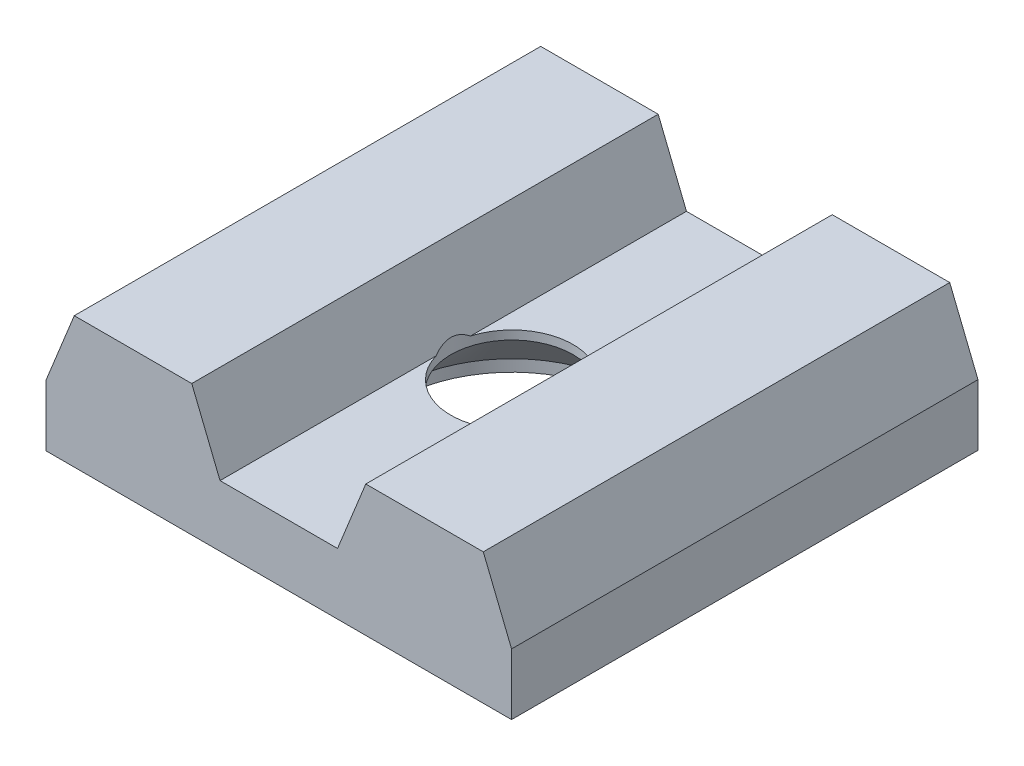
ISO-10303-21;
HEADER;
FILE_DESCRIPTION(('STEP AP214'),'2;1');
FILE_NAME('part.step','',(''),(''),'','','');
FILE_SCHEMA(('AUTOMOTIVE_DESIGN { 1 0 10303 214 1 1 1 1 }'));
ENDSEC;
DATA;
#1=APPLICATION_CONTEXT('core data for automotive mechanical design processes');
#2=APPLICATION_PROTOCOL_DEFINITION('international standard','automotive_design',2000,#1);
#3=PRODUCT_CONTEXT('',#1,'mechanical');
#4=PRODUCT('Part','Part','',(#3));
#5=PRODUCT_RELATED_PRODUCT_CATEGORY('part','',(#4));
#6=PRODUCT_DEFINITION_FORMATION('','',#4);
#7=PRODUCT_DEFINITION_CONTEXT('part definition',#1,'design');
#8=PRODUCT_DEFINITION('design','',#6,#7);
#9=PRODUCT_DEFINITION_SHAPE('','',#8);
#10=(LENGTH_UNIT() NAMED_UNIT(*) SI_UNIT(.MILLI.,.METRE.));
#11=(NAMED_UNIT(*) PLANE_ANGLE_UNIT() SI_UNIT($,.RADIAN.));
#12=(NAMED_UNIT(*) SI_UNIT($,.STERADIAN.) SOLID_ANGLE_UNIT());
#13=UNCERTAINTY_MEASURE_WITH_UNIT(LENGTH_MEASURE(1.E-05),#10,'distance_accuracy_value','');
#14=(GEOMETRIC_REPRESENTATION_CONTEXT(3) GLOBAL_UNCERTAINTY_ASSIGNED_CONTEXT((#13)) GLOBAL_UNIT_ASSIGNED_CONTEXT((#10,
#11,#12)) REPRESENTATION_CONTEXT('',''));
#15=CARTESIAN_POINT('',(0.,0.,0.));
#16=DIRECTION('',(0.,0.,1.));
#17=DIRECTION('',(1.,0.,0.));
#18=AXIS2_PLACEMENT_3D('',#15,#16,#17);
#19=CARTESIAN_POINT('',(-1.00758426449891,-1.2,8.));
#20=DIRECTION('',(0.,-1.,0.));
#21=DIRECTION('',(0.,0.,-1.));
#22=AXIS2_PLACEMENT_3D('',#19,#20,#21);
#23=PLANE('',#22);
#24=DIRECTION('',(0.,0.,-1.));
#25=VECTOR('',#24,1.);
#26=CARTESIAN_POINT('',(1.00758426449891,-1.2,8.));
#27=LINE('',#26,#25);
#28=CARTESIAN_POINT('',(1.00758426449891,-1.2,8.));
#29=VERTEX_POINT('',#28);
#30=CARTESIAN_POINT('',(1.00758426449891,-1.2,4.29542164770748));
#31=VERTEX_POINT('',#30);
#32=EDGE_CURVE('E154',#29,#31,#27,.T.);
#33=ORIENTED_EDGE('',*,*,#32,.T.);
#34=CARTESIAN_POINT('',(0.,-1.2,4.));
#35=DIRECTION('',(0.,-1.,0.));
#36=DIRECTION('',(0.,0.,-1.));
#37=AXIS2_PLACEMENT_3D('',#34,#35,#36);
#38=CIRCLE('',#37,1.05);
#39=CARTESIAN_POINT('',(-1.00758426449891,-1.2,4.29542164770748));
#40=VERTEX_POINT('',#39);
#41=EDGE_CURVE('E138',#31,#40,#38,.T.);
#42=ORIENTED_EDGE('',*,*,#41,.T.);
#43=DIRECTION('',(0.,0.,-1.));
#44=VECTOR('',#43,1.);
#45=CARTESIAN_POINT('',(-1.00758426449891,-1.2,8.));
#46=LINE('',#45,#44);
#47=CARTESIAN_POINT('',(-1.00758426449891,-1.2,8.));
#48=VERTEX_POINT('',#47);
#49=EDGE_CURVE('E151',#48,#40,#46,.T.);
#50=ORIENTED_EDGE('',*,*,#49,.F.);
#51=DIRECTION('',(-1.,0.,0.));
#52=VECTOR('',#51,1.);
#53=CARTESIAN_POINT('',(-1.00758426449891,-1.2,8.));
#54=LINE('',#53,#52);
#55=EDGE_CURVE('E223',#29,#48,#54,.T.);
#56=ORIENTED_EDGE('',*,*,#55,.F.);
#57=EDGE_LOOP('',(#33,#42,#50,#56));
#58=FACE_BOUND('',#57,.T.);
#59=ADVANCED_FACE('F33',(#58),#23,.F.);
#60=CARTESIAN_POINT('',(3.50758426449891,0.,8.));
#61=DIRECTION('',(-0.927183854566787,-0.374606593415913,0.));
#62=DIRECTION('',(0.374606593415913,-0.927183854566787,0.));
#63=AXIS2_PLACEMENT_3D('',#60,#61,#62);
#64=PLANE('',#63);
#65=DIRECTION('',(-0.374606593415913,0.927183854566787,0.));
#66=VECTOR('',#65,1.);
#67=CARTESIAN_POINT('',(3.50758426449891,0.,0.));
#68=LINE('',#67,#66);
#69=CARTESIAN_POINT('',(3.99241573550109,-1.2,0.));
#70=VERTEX_POINT('',#69);
#71=CARTESIAN_POINT('',(3.50758426449891,0.,0.));
#72=VERTEX_POINT('',#71);
#73=EDGE_CURVE('E214',#70,#72,#68,.T.);
#74=ORIENTED_EDGE('',*,*,#73,.T.);
#75=DIRECTION('',(0.,0.,-1.));
#76=VECTOR('',#75,1.);
#77=CARTESIAN_POINT('',(3.50758426449891,0.,8.));
#78=LINE('',#77,#76);
#79=CARTESIAN_POINT('',(3.50758426449891,0.,8.));
#80=VERTEX_POINT('',#79);
#81=EDGE_CURVE('E171',#80,#72,#78,.T.);
#82=ORIENTED_EDGE('',*,*,#81,.F.);
#83=DIRECTION('',(-0.374606593415913,0.927183854566787,0.));
#84=VECTOR('',#83,1.);
#85=CARTESIAN_POINT('',(3.50758426449891,0.,8.));
#86=LINE('',#85,#84);
#87=CARTESIAN_POINT('',(3.99241573550109,-1.2,8.));
#88=VERTEX_POINT('',#87);
#89=EDGE_CURVE('E215',#88,#80,#86,.T.);
#90=ORIENTED_EDGE('',*,*,#89,.F.);
#91=DIRECTION('',(0.,0.,-1.));
#92=VECTOR('',#91,1.);
#93=CARTESIAN_POINT('',(3.99241573550109,-1.2,8.));
#94=LINE('',#93,#92);
#95=EDGE_CURVE('E234',#88,#70,#94,.T.);
#96=ORIENTED_EDGE('',*,*,#95,.T.);
#97=EDGE_LOOP('',(#74,#82,#90,#96));
#98=FACE_BOUND('',#97,.T.);
#99=ADVANCED_FACE('F294',(#98),#64,.F.);
#100=CARTESIAN_POINT('',(3.50758426449891,0.,8.));
#101=DIRECTION('',(0.,-1.,0.));
#102=DIRECTION('',(1.,0.,0.));
#103=AXIS2_PLACEMENT_3D('',#100,#101,#102);
#104=PLANE('',#103);
#105=DIRECTION('',(-1.,0.,0.));
#106=VECTOR('',#105,1.);
#107=CARTESIAN_POINT('',(3.50758426449891,0.,0.));
#108=LINE('',#107,#106);
#109=CARTESIAN_POINT('',(1.49241573550109,0.,0.));
#110=VERTEX_POINT('',#109);
#111=EDGE_CURVE('E237',#72,#110,#108,.T.);
#112=ORIENTED_EDGE('',*,*,#111,.T.);
#113=DIRECTION('',(0.,0.,-1.));
#114=VECTOR('',#113,1.);
#115=CARTESIAN_POINT('',(1.49241573550109,0.,8.));
#116=LINE('',#115,#114);
#117=CARTESIAN_POINT('',(1.49241573550109,0.,8.));
#118=VERTEX_POINT('',#117);
#119=EDGE_CURVE('E168',#118,#110,#116,.T.);
#120=ORIENTED_EDGE('',*,*,#119,.F.);
#121=DIRECTION('',(-1.,0.,0.));
#122=VECTOR('',#121,1.);
#123=CARTESIAN_POINT('',(3.50758426449891,0.,8.));
#124=LINE('',#123,#122);
#125=EDGE_CURVE('E218',#80,#118,#124,.T.);
#126=ORIENTED_EDGE('',*,*,#125,.F.);
#127=ORIENTED_EDGE('',*,*,#81,.T.);
#128=EDGE_LOOP('',(#112,#120,#126,#127));
#129=FACE_BOUND('',#128,.T.);
#130=ADVANCED_FACE('F299',(#129),#104,.F.);
#131=CARTESIAN_POINT('',(1.49241573550109,0.,8.));
#132=DIRECTION('',(0.927183854566787,-0.374606593415913,0.));
#133=DIRECTION('',(0.374606593415913,0.927183854566787,0.));
#134=AXIS2_PLACEMENT_3D('',#131,#132,#133);
#135=PLANE('',#134);
#136=CARTESIAN_POINT('',(1.00758426449891,-1.2,3.70457835229252));
#137=VERTEX_POINT('',#136);
#138=CARTESIAN_POINT('',(1.00758426449891,-1.2,0.));
#139=VERTEX_POINT('',#138);
#140=EDGE_CURVE('E160',#137,#139,#27,.T.);
#141=ORIENTED_EDGE('',*,*,#140,.F.);
#142=CARTESIAN_POINT('',(0.,-3.69385856677036,4.));
#143=DIRECTION('',(0.927183854566787,-0.374606593415913,0.));
#144=DIRECTION('',(-0.374606593415913,-0.927183854566787,0.));
#145=AXIS2_PLACEMENT_3D('',#142,#143,#144);
#146=ELLIPSE('',#145,2.80294052068171,1.05);
#147=EDGE_CURVE('E155',#137,#31,#146,.T.);
#148=ORIENTED_EDGE('',*,*,#147,.T.);
#149=ORIENTED_EDGE('',*,*,#32,.F.);
#150=DIRECTION('',(-0.374606593415913,-0.927183854566787,0.));
#151=VECTOR('',#150,1.);
#152=CARTESIAN_POINT('',(1.49241573550109,0.,8.));
#153=LINE('',#152,#151);
#154=EDGE_CURVE('E221',#118,#29,#153,.T.);
#155=ORIENTED_EDGE('',*,*,#154,.F.);
#156=ORIENTED_EDGE('',*,*,#119,.T.);
#157=DIRECTION('',(-0.374606593415913,-0.927183854566787,0.));
#158=VECTOR('',#157,1.);
#159=CARTESIAN_POINT('',(1.49241573550109,0.,0.));
#160=LINE('',#159,#158);
#161=EDGE_CURVE('E239',#110,#139,#160,.T.);
#162=ORIENTED_EDGE('',*,*,#161,.T.);
#163=EDGE_LOOP('',(#141,#148,#149,#155,#156,#162));
#164=FACE_BOUND('',#163,.T.);
#165=ADVANCED_FACE('F302',(#164),#135,.F.);
#166=CARTESIAN_POINT('',(-1.00758426449891,-1.2,3.70457835229253));
#167=VERTEX_POINT('',#166);
#168=CARTESIAN_POINT('',(-1.00758426449891,-1.2,0.));
#169=VERTEX_POINT('',#168);
#170=EDGE_CURVE('E161',#167,#169,#46,.T.);
#171=ORIENTED_EDGE('',*,*,#170,.F.);
#172=EDGE_CURVE('E141',#167,#137,#38,.T.);
#173=ORIENTED_EDGE('',*,*,#172,.T.);
#174=ORIENTED_EDGE('',*,*,#140,.T.);
#175=DIRECTION('',(-1.,0.,0.));
#176=VECTOR('',#175,1.);
#177=CARTESIAN_POINT('',(-1.00758426449891,-1.2,0.));
#178=LINE('',#177,#176);
#179=EDGE_CURVE('E242',#139,#169,#178,.T.);
#180=ORIENTED_EDGE('',*,*,#179,.T.);
#181=EDGE_LOOP('',(#171,#173,#174,#180));
#182=FACE_BOUND('',#181,.T.);
#183=ADVANCED_FACE('F304',(#182),#23,.F.);
#184=CARTESIAN_POINT('',(-1.49241573550109,0.,8.));
#185=DIRECTION('',(-0.927183854566787,-0.374606593415913,0.));
#186=DIRECTION('',(0.374606593415913,-0.927183854566787,0.));
#187=AXIS2_PLACEMENT_3D('',#184,#185,#186);
#188=PLANE('',#187);
#189=ORIENTED_EDGE('',*,*,#49,.T.);
#190=CARTESIAN_POINT('',(0.,-3.69385856677036,4.));
#191=DIRECTION('',(-0.927183854566787,-0.374606593415913,0.));
#192=DIRECTION('',(0.374606593415913,-0.927183854566787,0.));
#193=AXIS2_PLACEMENT_3D('',#190,#191,#192);
#194=ELLIPSE('',#193,2.80294052068171,1.05);
#195=EDGE_CURVE('E135',#40,#167,#194,.T.);
#196=ORIENTED_EDGE('',*,*,#195,.T.);
#197=ORIENTED_EDGE('',*,*,#170,.T.);
#198=DIRECTION('',(-0.374606593415913,0.927183854566787,0.));
#199=VECTOR('',#198,1.);
#200=CARTESIAN_POINT('',(-1.49241573550109,0.,0.));
#201=LINE('',#200,#199);
#202=CARTESIAN_POINT('',(-1.49241573550109,0.,0.));
#203=VERTEX_POINT('',#202);
#204=EDGE_CURVE('E245',#169,#203,#201,.T.);
#205=ORIENTED_EDGE('',*,*,#204,.T.);
#206=DIRECTION('',(0.,0.,-1.));
#207=VECTOR('',#206,1.);
#208=CARTESIAN_POINT('',(-1.49241573550109,0.,8.));
#209=LINE('',#208,#207);
#210=CARTESIAN_POINT('',(-1.49241573550109,0.,8.));
#211=VERTEX_POINT('',#210);
#212=EDGE_CURVE('E164',#211,#203,#209,.T.);
#213=ORIENTED_EDGE('',*,*,#212,.F.);
#214=DIRECTION('',(-0.374606593415913,0.927183854566787,0.));
#215=VECTOR('',#214,1.);
#216=CARTESIAN_POINT('',(-1.49241573550109,0.,8.));
#217=LINE('',#216,#215);
#218=EDGE_CURVE('E159',#48,#211,#217,.T.);
#219=ORIENTED_EDGE('',*,*,#218,.F.);
#220=EDGE_LOOP('',(#189,#196,#197,#205,#213,#219));
#221=FACE_BOUND('',#220,.T.);
#222=ADVANCED_FACE('F157',(#221),#188,.F.);
#223=CARTESIAN_POINT('',(-3.50758426449891,0.,8.));
#224=DIRECTION('',(0.,-1.,0.));
#225=DIRECTION('',(1.,0.,0.));
#226=AXIS2_PLACEMENT_3D('',#223,#224,#225);
#227=PLANE('',#226);
#228=DIRECTION('',(-1.,0.,0.));
#229=VECTOR('',#228,1.);
#230=CARTESIAN_POINT('',(-3.50758426449891,0.,0.));
#231=LINE('',#230,#229);
#232=CARTESIAN_POINT('',(-3.50758426449891,0.,0.));
#233=VERTEX_POINT('',#232);
#234=EDGE_CURVE('E247',#203,#233,#231,.T.);
#235=ORIENTED_EDGE('',*,*,#234,.T.);
#236=DIRECTION('',(0.,0.,-1.));
#237=VECTOR('',#236,1.);
#238=CARTESIAN_POINT('',(-3.50758426449891,0.,8.));
#239=LINE('',#238,#237);
#240=CARTESIAN_POINT('',(-3.50758426449891,0.,8.));
#241=VERTEX_POINT('',#240);
#242=EDGE_CURVE('E258',#241,#233,#239,.T.);
#243=ORIENTED_EDGE('',*,*,#242,.F.);
#244=DIRECTION('',(-1.,0.,0.));
#245=VECTOR('',#244,1.);
#246=CARTESIAN_POINT('',(-3.50758426449891,0.,8.));
#247=LINE('',#246,#245);
#248=EDGE_CURVE('E226',#211,#241,#247,.T.);
#249=ORIENTED_EDGE('',*,*,#248,.F.);
#250=ORIENTED_EDGE('',*,*,#212,.T.);
#251=EDGE_LOOP('',(#235,#243,#249,#250));
#252=FACE_BOUND('',#251,.T.);
#253=ADVANCED_FACE('F268',(#252),#227,.F.);
#254=CARTESIAN_POINT('',(-3.50758426449891,0.,8.));
#255=DIRECTION('',(0.927183854566787,-0.374606593415913,0.));
#256=DIRECTION('',(0.374606593415913,0.927183854566787,0.));
#257=AXIS2_PLACEMENT_3D('',#254,#255,#256);
#258=PLANE('',#257);
#259=DIRECTION('',(-0.374606593415913,-0.927183854566787,0.));
#260=VECTOR('',#259,1.);
#261=CARTESIAN_POINT('',(-3.50758426449891,0.,0.));
#262=LINE('',#261,#260);
#263=CARTESIAN_POINT('',(-3.99241573550109,-1.2,0.));
#264=VERTEX_POINT('',#263);
#265=EDGE_CURVE('E249',#233,#264,#262,.T.);
#266=ORIENTED_EDGE('',*,*,#265,.T.);
#267=DIRECTION('',(0.,0.,-1.));
#268=VECTOR('',#267,1.);
#269=CARTESIAN_POINT('',(-3.99241573550109,-1.2,8.));
#270=LINE('',#269,#268);
#271=CARTESIAN_POINT('',(-3.99241573550109,-1.2,8.));
#272=VERTEX_POINT('',#271);
#273=EDGE_CURVE('E256',#272,#264,#270,.T.);
#274=ORIENTED_EDGE('',*,*,#273,.F.);
#275=DIRECTION('',(-0.374606593415913,-0.927183854566787,0.));
#276=VECTOR('',#275,1.);
#277=CARTESIAN_POINT('',(-3.50758426449891,0.,8.));
#278=LINE('',#277,#276);
#279=EDGE_CURVE('E228',#241,#272,#278,.T.);
#280=ORIENTED_EDGE('',*,*,#279,.F.);
#281=ORIENTED_EDGE('',*,*,#242,.T.);
#282=EDGE_LOOP('',(#266,#274,#280,#281));
#283=FACE_BOUND('',#282,.T.);
#284=ADVANCED_FACE('F273',(#283),#258,.F.);
#285=CARTESIAN_POINT('',(-3.99241573550109,-1.2,8.));
#286=DIRECTION('',(1.,0.,0.));
#287=DIRECTION('',(0.,0.,-1.));
#288=AXIS2_PLACEMENT_3D('',#285,#286,#287);
#289=PLANE('',#288);
#290=DIRECTION('',(0.,-1.,0.));
#291=VECTOR('',#290,1.);
#292=CARTESIAN_POINT('',(-3.99241573550109,-1.2,0.));
#293=LINE('',#292,#291);
#294=CARTESIAN_POINT('',(-3.99241573550109,-2.25,0.));
#295=VERTEX_POINT('',#294);
#296=EDGE_CURVE('E251',#264,#295,#293,.T.);
#297=ORIENTED_EDGE('',*,*,#296,.T.);
#298=DIRECTION('',(0.,0.,1.));
#299=VECTOR('',#298,1.);
#300=CARTESIAN_POINT('',(-3.99241573550109,-2.25,8.));
#301=LINE('',#300,#299);
#302=CARTESIAN_POINT('',(-3.99241573550109,-2.25,8.));
#303=VERTEX_POINT('',#302);
#304=EDGE_CURVE('E42',#295,#303,#301,.T.);
#305=ORIENTED_EDGE('',*,*,#304,.T.);
#306=DIRECTION('',(0.,-1.,0.));
#307=VECTOR('',#306,1.);
#308=CARTESIAN_POINT('',(-3.99241573550109,-1.2,8.));
#309=LINE('',#308,#307);
#310=EDGE_CURVE('E230',#272,#303,#309,.T.);
#311=ORIENTED_EDGE('',*,*,#310,.F.);
#312=ORIENTED_EDGE('',*,*,#273,.T.);
#313=EDGE_LOOP('',(#297,#305,#311,#312));
#314=FACE_BOUND('',#313,.T.);
#315=ADVANCED_FACE('F274',(#314),#289,.F.);
#316=CARTESIAN_POINT('',(-3.99241573550109,-2.5,8.));
#317=DIRECTION('',(0.,1.,0.));
#318=DIRECTION('',(-1.,0.,0.));
#319=AXIS2_PLACEMENT_3D('',#316,#317,#318);
#320=PLANE('',#319);
#321=DIRECTION('',(1.,0.,0.));
#322=VECTOR('',#321,1.);
#323=CARTESIAN_POINT('',(-3.99241573550109,-2.5,0.25));
#324=LINE('',#323,#322);
#325=CARTESIAN_POINT('',(-3.74241573550109,-2.5,0.25));
#326=VERTEX_POINT('',#325);
#327=CARTESIAN_POINT('',(3.74241573550109,-2.5,0.25));
#328=VERTEX_POINT('',#327);
#329=EDGE_CURVE('E180',#326,#328,#324,.T.);
#330=ORIENTED_EDGE('',*,*,#329,.T.);
#331=DIRECTION('',(0.,0.,1.));
#332=VECTOR('',#331,1.);
#333=CARTESIAN_POINT('',(3.74241573550109,-2.5,8.));
#334=LINE('',#333,#332);
#335=CARTESIAN_POINT('',(3.74241573550109,-2.5,7.75));
#336=VERTEX_POINT('',#335);
#337=EDGE_CURVE('E186',#328,#336,#334,.T.);
#338=ORIENTED_EDGE('',*,*,#337,.T.);
#339=DIRECTION('',(-1.,0.,0.));
#340=VECTOR('',#339,1.);
#341=CARTESIAN_POINT('',(-3.99241573550109,-2.5,7.75));
#342=LINE('',#341,#340);
#343=CARTESIAN_POINT('',(-3.74241573550109,-2.5,7.75));
#344=VERTEX_POINT('',#343);
#345=EDGE_CURVE('E184',#336,#344,#342,.T.);
#346=ORIENTED_EDGE('',*,*,#345,.T.);
#347=DIRECTION('',(0.,0.,-1.));
#348=VECTOR('',#347,1.);
#349=CARTESIAN_POINT('',(-3.74241573550109,-2.5,8.));
#350=LINE('',#349,#348);
#351=EDGE_CURVE('E182',#344,#326,#350,.T.);
#352=ORIENTED_EDGE('',*,*,#351,.T.);
#353=EDGE_LOOP('',(#330,#338,#346,#352));
#354=FACE_BOUND('',#353,.T.);
#355=CARTESIAN_POINT('',(0.,-2.5,4.));
#356=DIRECTION('',(0.,-1.,0.));
#357=DIRECTION('',(0.,0.,-1.));
#358=AXIS2_PLACEMENT_3D('',#355,#356,#357);
#359=CIRCLE('',#358,2.);
#360=CARTESIAN_POINT('',(0.,-2.5,2.));
#361=VERTEX_POINT('',#360);
#362=EDGE_CURVE('E177',#361,#361,#359,.T.);
#363=ORIENTED_EDGE('',*,*,#362,.F.);
#364=EDGE_LOOP('',(#363));
#365=FACE_BOUND('',#364,.T.);
#366=ADVANCED_FACE('F353',(#354,#365),#320,.F.);
#367=CARTESIAN_POINT('',(3.99241573550109,-2.5,8.));
#368=DIRECTION('',(-1.,0.,0.));
#369=DIRECTION('',(0.,0.,1.));
#370=AXIS2_PLACEMENT_3D('',#367,#368,#369);
#371=PLANE('',#370);
#372=DIRECTION('',(0.,1.,0.));
#373=VECTOR('',#372,1.);
#374=CARTESIAN_POINT('',(3.99241573550109,-2.5,8.));
#375=LINE('',#374,#373);
#376=CARTESIAN_POINT('',(3.99241573550109,-2.25,8.));
#377=VERTEX_POINT('',#376);
#378=EDGE_CURVE('E232',#377,#88,#375,.T.);
#379=ORIENTED_EDGE('',*,*,#378,.F.);
#380=DIRECTION('',(0.,0.,-1.));
#381=VECTOR('',#380,1.);
#382=CARTESIAN_POINT('',(3.99241573550109,-2.25,8.));
#383=LINE('',#382,#381);
#384=CARTESIAN_POINT('',(3.99241573550109,-2.25,0.));
#385=VERTEX_POINT('',#384);
#386=EDGE_CURVE('E174',#377,#385,#383,.T.);
#387=ORIENTED_EDGE('',*,*,#386,.T.);
#388=DIRECTION('',(0.,1.,0.));
#389=VECTOR('',#388,1.);
#390=CARTESIAN_POINT('',(3.99241573550109,-2.5,0.));
#391=LINE('',#390,#389);
#392=EDGE_CURVE('E219',#385,#70,#391,.T.);
#393=ORIENTED_EDGE('',*,*,#392,.T.);
#394=ORIENTED_EDGE('',*,*,#95,.F.);
#395=EDGE_LOOP('',(#379,#387,#393,#394));
#396=FACE_BOUND('',#395,.T.);
#397=ADVANCED_FACE('F288',(#396),#371,.F.);
#398=CARTESIAN_POINT('',(0.,0.,8.));
#399=DIRECTION('',(0.,0.,1.));
#400=DIRECTION('',(1.,0.,0.));
#401=AXIS2_PLACEMENT_3D('',#398,#399,#400);
#402=PLANE('',#401);
#403=ORIENTED_EDGE('',*,*,#310,.T.);
#404=DIRECTION('',(1.,0.,0.));
#405=VECTOR('',#404,1.);
#406=CARTESIAN_POINT('',(3.99241573550109,-2.25,8.));
#407=LINE('',#406,#405);
#408=EDGE_CURVE('E189',#303,#377,#407,.T.);
#409=ORIENTED_EDGE('',*,*,#408,.T.);
#410=ORIENTED_EDGE('',*,*,#378,.T.);
#411=ORIENTED_EDGE('',*,*,#89,.T.);
#412=ORIENTED_EDGE('',*,*,#125,.T.);
#413=ORIENTED_EDGE('',*,*,#154,.T.);
#414=ORIENTED_EDGE('',*,*,#55,.T.);
#415=ORIENTED_EDGE('',*,*,#218,.T.);
#416=ORIENTED_EDGE('',*,*,#248,.T.);
#417=ORIENTED_EDGE('',*,*,#279,.T.);
#418=EDGE_LOOP('',(#403,#409,#410,#411,#412,#413,#414,#415,#416,#417));
#419=FACE_BOUND('',#418,.T.);
#420=ADVANCED_FACE('F276',(#419),#402,.T.);
#421=CARTESIAN_POINT('',(0.,0.,0.));
#422=DIRECTION('',(0.,0.,1.));
#423=DIRECTION('',(1.,0.,0.));
#424=AXIS2_PLACEMENT_3D('',#421,#422,#423);
#425=PLANE('',#424);
#426=ORIENTED_EDGE('',*,*,#392,.F.);
#427=DIRECTION('',(-1.,0.,0.));
#428=VECTOR('',#427,1.);
#429=CARTESIAN_POINT('',(0.,-2.25,0.));
#430=LINE('',#429,#428);
#431=EDGE_CURVE('E11',#385,#295,#430,.T.);
#432=ORIENTED_EDGE('',*,*,#431,.T.);
#433=ORIENTED_EDGE('',*,*,#296,.F.);
#434=ORIENTED_EDGE('',*,*,#265,.F.);
#435=ORIENTED_EDGE('',*,*,#234,.F.);
#436=ORIENTED_EDGE('',*,*,#204,.F.);
#437=ORIENTED_EDGE('',*,*,#179,.F.);
#438=ORIENTED_EDGE('',*,*,#161,.F.);
#439=ORIENTED_EDGE('',*,*,#111,.F.);
#440=ORIENTED_EDGE('',*,*,#73,.F.);
#441=EDGE_LOOP('',(#426,#432,#433,#434,#435,#436,#437,#438,#439,#440));
#442=FACE_BOUND('',#441,.T.);
#443=ADVANCED_FACE('F270',(#442),#425,.F.);
#444=CARTESIAN_POINT('',(0.,0.,4.));
#445=DIRECTION('',(0.,-1.,0.));
#446=DIRECTION('',(1.,0.,0.));
#447=AXIS2_PLACEMENT_3D('',#444,#445,#446);
#448=CYLINDRICAL_SURFACE('',#447,1.05);
#449=CARTESIAN_POINT('',(0.,-1.35,4.));
#450=DIRECTION('',(0.,-1.,0.));
#451=DIRECTION('',(0.,0.,-1.));
#452=AXIS2_PLACEMENT_3D('',#449,#450,#451);
#453=CIRCLE('',#452,1.05);
#454=CARTESIAN_POINT('',(0.,-1.35,2.95));
#455=VERTEX_POINT('',#454);
#456=EDGE_CURVE('E145',#455,#455,#453,.T.);
#457=ORIENTED_EDGE('',*,*,#456,.T.);
#458=EDGE_LOOP('',(#457));
#459=FACE_BOUND('',#458,.T.);
#460=ORIENTED_EDGE('',*,*,#172,.F.);
#461=ORIENTED_EDGE('',*,*,#195,.F.);
#462=ORIENTED_EDGE('',*,*,#41,.F.);
#463=ORIENTED_EDGE('',*,*,#147,.F.);
#464=EDGE_LOOP('',(#460,#461,#462,#463));
#465=FACE_BOUND('',#464,.T.);
#466=ADVANCED_FACE('F137',(#459,#465),#448,.F.);
#467=CARTESIAN_POINT('',(0.,-2.3,4.));
#468=DIRECTION('',(0.,-1.,0.));
#469=DIRECTION('',(0.,0.,-1.));
#470=AXIS2_PLACEMENT_3D('',#467,#468,#469);
#471=CONICAL_SURFACE('',#470,2.,0.785398163397447);
#472=CARTESIAN_POINT('',(0.,-2.3,4.));
#473=DIRECTION('',(0.,-1.,0.));
#474=DIRECTION('',(0.,0.,-1.));
#475=AXIS2_PLACEMENT_3D('',#472,#473,#474);
#476=CIRCLE('',#475,2.);
#477=CARTESIAN_POINT('',(0.,-2.3,2.));
#478=VERTEX_POINT('',#477);
#479=EDGE_CURVE('E201',#478,#478,#476,.T.);
#480=ORIENTED_EDGE('',*,*,#479,.T.);
#481=EDGE_LOOP('',(#480));
#482=FACE_BOUND('',#481,.T.);
#483=ORIENTED_EDGE('',*,*,#456,.F.);
#484=EDGE_LOOP('',(#483));
#485=FACE_BOUND('',#484,.T.);
#486=ADVANCED_FACE('F335',(#482,#485),#471,.F.);
#487=CARTESIAN_POINT('',(0.,-2.5,4.));
#488=DIRECTION('',(0.,-1.,0.));
#489=DIRECTION('',(0.,0.,-1.));
#490=AXIS2_PLACEMENT_3D('',#487,#488,#489);
#491=CYLINDRICAL_SURFACE('',#490,2.);
#492=ORIENTED_EDGE('',*,*,#479,.F.);
#493=EDGE_LOOP('',(#492));
#494=FACE_BOUND('',#493,.T.);
#495=ORIENTED_EDGE('',*,*,#362,.T.);
#496=EDGE_LOOP('',(#495));
#497=FACE_BOUND('',#496,.T.);
#498=ADVANCED_FACE('F331',(#494,#497),#491,.F.);
#499=CARTESIAN_POINT('',(-3.74241573550109,-2.5,8.));
#500=DIRECTION('',(0.70710678118655,0.707106781186545,0.));
#501=DIRECTION('',(0.,0.,-1.));
#502=AXIS2_PLACEMENT_3D('',#499,#500,#501);
#503=PLANE('',#502);
#504=DIRECTION('',(-0.577350269189624,0.577350269189628,-0.577350269189624));
#505=VECTOR('',#504,1.);
#506=CARTESIAN_POINT('',(-3.82574906883443,-2.41666666666667,0.166666666666667));
#507=LINE('',#506,#505);
#508=EDGE_CURVE('E195',#326,#295,#507,.T.);
#509=ORIENTED_EDGE('',*,*,#508,.F.);
#510=ORIENTED_EDGE('',*,*,#351,.F.);
#511=DIRECTION('',(0.577350269189624,-0.577350269189628,-0.577350269189624));
#512=VECTOR('',#511,1.);
#513=CARTESIAN_POINT('',(-3.82574906883443,-2.41666666666667,7.83333333333333));
#514=LINE('',#513,#512);
#515=EDGE_CURVE('E37',#303,#344,#514,.T.);
#516=ORIENTED_EDGE('',*,*,#515,.F.);
#517=ORIENTED_EDGE('',*,*,#304,.F.);
#518=EDGE_LOOP('',(#509,#510,#516,#517));
#519=FACE_BOUND('',#518,.T.);
#520=ADVANCED_FACE('F35',(#519),#503,.F.);
#521=CARTESIAN_POINT('',(0.,-2.25,8.));
#522=DIRECTION('',(0.,-0.707106781186545,0.70710678118655));
#523=DIRECTION('',(-1.,0.,0.));
#524=AXIS2_PLACEMENT_3D('',#521,#522,#523);
#525=PLANE('',#524);
#526=ORIENTED_EDGE('',*,*,#515,.T.);
#527=ORIENTED_EDGE('',*,*,#345,.F.);
#528=DIRECTION('',(-0.577350269189624,-0.577350269189628,-0.577350269189624));
#529=VECTOR('',#528,1.);
#530=CARTESIAN_POINT('',(2.66161049033407,-3.58080524516703,6.66919475483297));
#531=LINE('',#530,#529);
#532=EDGE_CURVE('E194',#377,#336,#531,.T.);
#533=ORIENTED_EDGE('',*,*,#532,.F.);
#534=ORIENTED_EDGE('',*,*,#408,.F.);
#535=EDGE_LOOP('',(#526,#527,#533,#534));
#536=FACE_BOUND('',#535,.T.);
#537=ADVANCED_FACE('F281',(#536),#525,.T.);
#538=CARTESIAN_POINT('',(-3.99241573550109,-2.5,0.25));
#539=DIRECTION('',(0.,0.707106781186545,0.70710678118655));
#540=DIRECTION('',(1.,0.,0.));
#541=AXIS2_PLACEMENT_3D('',#538,#539,#540);
#542=PLANE('',#541);
#543=ORIENTED_EDGE('',*,*,#508,.T.);
#544=ORIENTED_EDGE('',*,*,#431,.F.);
#545=DIRECTION('',(-0.577350269189624,-0.577350269189628,0.577350269189624));
#546=VECTOR('',#545,1.);
#547=CARTESIAN_POINT('',(1.16413857850038,-5.07827715700074,2.82827715700072));
#548=LINE('',#547,#546);
#549=EDGE_CURVE('E192',#328,#385,#548,.F.);
#550=ORIENTED_EDGE('',*,*,#549,.F.);
#551=ORIENTED_EDGE('',*,*,#329,.F.);
#552=EDGE_LOOP('',(#543,#544,#550,#551));
#553=FACE_BOUND('',#552,.T.);
#554=ADVANCED_FACE('F325',(#553),#542,.F.);
#555=CARTESIAN_POINT('',(3.99241573550109,-2.25,8.));
#556=DIRECTION('',(-0.70710678118655,0.707106781186545,0.));
#557=DIRECTION('',(0.,0.,-1.));
#558=AXIS2_PLACEMENT_3D('',#555,#556,#557);
#559=PLANE('',#558);
#560=ORIENTED_EDGE('',*,*,#532,.T.);
#561=ORIENTED_EDGE('',*,*,#337,.F.);
#562=ORIENTED_EDGE('',*,*,#549,.T.);
#563=ORIENTED_EDGE('',*,*,#386,.F.);
#564=EDGE_LOOP('',(#560,#561,#562,#563));
#565=FACE_BOUND('',#564,.T.);
#566=ADVANCED_FACE('F285',(#565),#559,.F.);
#567=CLOSED_SHELL('',(#59,#99,#130,#165,#183,#222,#253,#284,#315,#366,#397,#420,#443,#466,#486,
#498,#520,#537,#554,#566));
#568=MANIFOLD_SOLID_BREP('B2',#567);
#569=ADVANCED_BREP_SHAPE_REPRESENTATION('',(#18,#568),#14);
#570=SHAPE_DEFINITION_REPRESENTATION(#9,#569);
ENDSEC;
END-ISO-10303-21;
